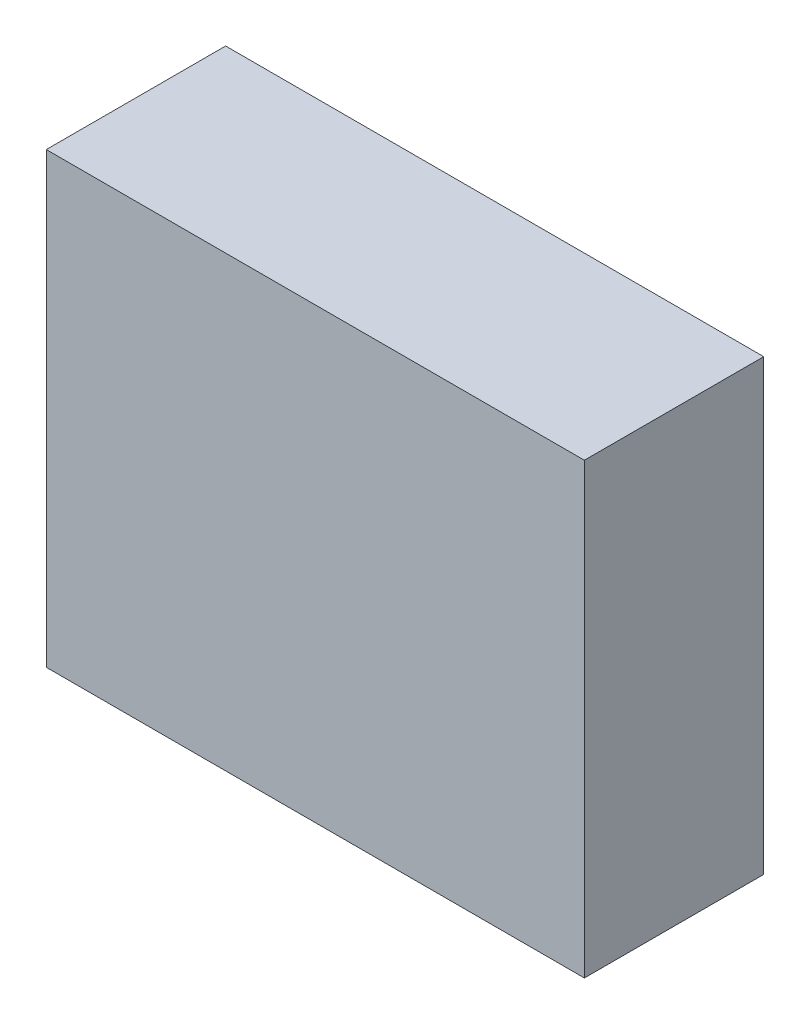
ISO-10303-21;
HEADER;
FILE_DESCRIPTION(('STEP AP214'),'2;1');
FILE_NAME('part.step','',(''),(''),'','','');
FILE_SCHEMA(('AUTOMOTIVE_DESIGN { 1 0 10303 214 1 1 1 1 }'));
ENDSEC;
DATA;
#1=APPLICATION_CONTEXT('core data for automotive mechanical design processes');
#2=APPLICATION_PROTOCOL_DEFINITION('international standard','automotive_design',2000,#1);
#3=PRODUCT_CONTEXT('',#1,'mechanical');
#4=PRODUCT('Part','Part','',(#3));
#5=PRODUCT_RELATED_PRODUCT_CATEGORY('part','',(#4));
#6=PRODUCT_DEFINITION_FORMATION('','',#4);
#7=PRODUCT_DEFINITION_CONTEXT('part definition',#1,'design');
#8=PRODUCT_DEFINITION('design','',#6,#7);
#9=PRODUCT_DEFINITION_SHAPE('','',#8);
#10=(LENGTH_UNIT() NAMED_UNIT(*) SI_UNIT(.MILLI.,.METRE.));
#11=(NAMED_UNIT(*) PLANE_ANGLE_UNIT() SI_UNIT($,.RADIAN.));
#12=(NAMED_UNIT(*) SI_UNIT($,.STERADIAN.) SOLID_ANGLE_UNIT());
#13=UNCERTAINTY_MEASURE_WITH_UNIT(LENGTH_MEASURE(1.E-05),#10,'distance_accuracy_value','');
#14=(GEOMETRIC_REPRESENTATION_CONTEXT(3) GLOBAL_UNCERTAINTY_ASSIGNED_CONTEXT((#13)) GLOBAL_UNIT_ASSIGNED_CONTEXT((#10,
#11,#12)) REPRESENTATION_CONTEXT('',''));
#15=CARTESIAN_POINT('',(0.,0.,0.));
#16=DIRECTION('',(0.,0.,1.));
#17=DIRECTION('',(1.,0.,0.));
#18=AXIS2_PLACEMENT_3D('',#15,#16,#17);
#19=CARTESIAN_POINT('',(15.,-12.5,10.));
#20=DIRECTION('',(-1.,0.,0.));
#21=DIRECTION('',(0.,0.,1.));
#22=AXIS2_PLACEMENT_3D('',#19,#20,#21);
#23=PLANE('',#22);
#24=DIRECTION('',(0.,1.,0.));
#25=VECTOR('',#24,1.);
#26=CARTESIAN_POINT('',(15.,-12.5,0.));
#27=LINE('',#26,#25);
#28=CARTESIAN_POINT('',(15.,-12.5,0.));
#29=VERTEX_POINT('',#28);
#30=CARTESIAN_POINT('',(15.,12.5,0.));
#31=VERTEX_POINT('',#30);
#32=EDGE_CURVE('E96',#29,#31,#27,.T.);
#33=ORIENTED_EDGE('',*,*,#32,.T.);
#34=DIRECTION('',(0.,0.,-1.));
#35=VECTOR('',#34,1.);
#36=CARTESIAN_POINT('',(15.,12.5,10.));
#37=LINE('',#36,#35);
#38=CARTESIAN_POINT('',(15.,12.5,10.));
#39=VERTEX_POINT('',#38);
#40=EDGE_CURVE('E11',#39,#31,#37,.T.);
#41=ORIENTED_EDGE('',*,*,#40,.F.);
#42=DIRECTION('',(0.,1.,0.));
#43=VECTOR('',#42,1.);
#44=CARTESIAN_POINT('',(15.,-12.5,10.));
#45=LINE('',#44,#43);
#46=CARTESIAN_POINT('',(15.,-12.5,10.));
#47=VERTEX_POINT('',#46);
#48=EDGE_CURVE('E84',#47,#39,#45,.T.);
#49=ORIENTED_EDGE('',*,*,#48,.F.);
#50=DIRECTION('',(0.,0.,-1.));
#51=VECTOR('',#50,1.);
#52=CARTESIAN_POINT('',(15.,-12.5,10.));
#53=LINE('',#52,#51);
#54=EDGE_CURVE('E92',#47,#29,#53,.T.);
#55=ORIENTED_EDGE('',*,*,#54,.T.);
#56=EDGE_LOOP('',(#33,#41,#49,#55));
#57=FACE_BOUND('',#56,.T.);
#58=ADVANCED_FACE('F33',(#57),#23,.F.);
#59=CARTESIAN_POINT('',(-15.,12.5,10.));
#60=DIRECTION('',(0.,-1.,0.));
#61=DIRECTION('',(0.,0.,-1.));
#62=AXIS2_PLACEMENT_3D('',#59,#60,#61);
#63=PLANE('',#62);
#64=DIRECTION('',(-1.,0.,0.));
#65=VECTOR('',#64,1.);
#66=CARTESIAN_POINT('',(-15.,12.5,0.));
#67=LINE('',#66,#65);
#68=CARTESIAN_POINT('',(-15.,12.5,0.));
#69=VERTEX_POINT('',#68);
#70=EDGE_CURVE('E88',#31,#69,#67,.T.);
#71=ORIENTED_EDGE('',*,*,#70,.T.);
#72=DIRECTION('',(0.,0.,-1.));
#73=VECTOR('',#72,1.);
#74=CARTESIAN_POINT('',(-15.,12.5,10.));
#75=LINE('',#74,#73);
#76=CARTESIAN_POINT('',(-15.,12.5,10.));
#77=VERTEX_POINT('',#76);
#78=EDGE_CURVE('E41',#77,#69,#75,.T.);
#79=ORIENTED_EDGE('',*,*,#78,.F.);
#80=DIRECTION('',(-1.,0.,0.));
#81=VECTOR('',#80,1.);
#82=CARTESIAN_POINT('',(-15.,12.5,10.));
#83=LINE('',#82,#81);
#84=EDGE_CURVE('E79',#39,#77,#83,.T.);
#85=ORIENTED_EDGE('',*,*,#84,.F.);
#86=ORIENTED_EDGE('',*,*,#40,.T.);
#87=EDGE_LOOP('',(#71,#79,#85,#86));
#88=FACE_BOUND('',#87,.T.);
#89=ADVANCED_FACE('F87',(#88),#63,.F.);
#90=CARTESIAN_POINT('',(-15.,-12.5,10.));
#91=DIRECTION('',(1.,0.,0.));
#92=DIRECTION('',(0.,0.,-1.));
#93=AXIS2_PLACEMENT_3D('',#90,#91,#92);
#94=PLANE('',#93);
#95=DIRECTION('',(0.,-1.,0.));
#96=VECTOR('',#95,1.);
#97=CARTESIAN_POINT('',(-15.,-12.5,0.));
#98=LINE('',#97,#96);
#99=CARTESIAN_POINT('',(-15.,-12.5,0.));
#100=VERTEX_POINT('',#99);
#101=EDGE_CURVE('E66',#69,#100,#98,.T.);
#102=ORIENTED_EDGE('',*,*,#101,.T.);
#103=DIRECTION('',(0.,0.,-1.));
#104=VECTOR('',#103,1.);
#105=CARTESIAN_POINT('',(-15.,-12.5,10.));
#106=LINE('',#105,#104);
#107=CARTESIAN_POINT('',(-15.,-12.5,10.));
#108=VERTEX_POINT('',#107);
#109=EDGE_CURVE('E89',#108,#100,#106,.T.);
#110=ORIENTED_EDGE('',*,*,#109,.F.);
#111=DIRECTION('',(0.,-1.,0.));
#112=VECTOR('',#111,1.);
#113=CARTESIAN_POINT('',(-15.,-12.5,10.));
#114=LINE('',#113,#112);
#115=EDGE_CURVE('E82',#77,#108,#114,.T.);
#116=ORIENTED_EDGE('',*,*,#115,.F.);
#117=ORIENTED_EDGE('',*,*,#78,.T.);
#118=EDGE_LOOP('',(#102,#110,#116,#117));
#119=FACE_BOUND('',#118,.T.);
#120=ADVANCED_FACE('F90',(#119),#94,.F.);
#121=CARTESIAN_POINT('',(-15.,-12.5,10.));
#122=DIRECTION('',(0.,1.,0.));
#123=DIRECTION('',(0.,0.,1.));
#124=AXIS2_PLACEMENT_3D('',#121,#122,#123);
#125=PLANE('',#124);
#126=DIRECTION('',(1.,0.,0.));
#127=VECTOR('',#126,1.);
#128=CARTESIAN_POINT('',(-15.,-12.5,0.));
#129=LINE('',#128,#127);
#130=EDGE_CURVE('E72',#100,#29,#129,.T.);
#131=ORIENTED_EDGE('',*,*,#130,.T.);
#132=ORIENTED_EDGE('',*,*,#54,.F.);
#133=DIRECTION('',(1.,0.,0.));
#134=VECTOR('',#133,1.);
#135=CARTESIAN_POINT('',(-15.,-12.5,10.));
#136=LINE('',#135,#134);
#137=EDGE_CURVE('E49',#108,#47,#136,.T.);
#138=ORIENTED_EDGE('',*,*,#137,.F.);
#139=ORIENTED_EDGE('',*,*,#109,.T.);
#140=EDGE_LOOP('',(#131,#132,#138,#139));
#141=FACE_BOUND('',#140,.T.);
#142=ADVANCED_FACE('F103',(#141),#125,.F.);
#143=CARTESIAN_POINT('',(0.,0.,10.));
#144=DIRECTION('',(0.,0.,-1.));
#145=DIRECTION('',(-1.,0.,0.));
#146=AXIS2_PLACEMENT_3D('',#143,#144,#145);
#147=PLANE('',#146);
#148=ORIENTED_EDGE('',*,*,#48,.T.);
#149=ORIENTED_EDGE('',*,*,#84,.T.);
#150=ORIENTED_EDGE('',*,*,#115,.T.);
#151=ORIENTED_EDGE('',*,*,#137,.T.);
#152=EDGE_LOOP('',(#148,#149,#150,#151));
#153=FACE_BOUND('',#152,.T.);
#154=ADVANCED_FACE('F80',(#153),#147,.F.);
#155=CARTESIAN_POINT('',(0.,0.,0.));
#156=DIRECTION('',(0.,0.,-1.));
#157=DIRECTION('',(-1.,0.,0.));
#158=AXIS2_PLACEMENT_3D('',#155,#156,#157);
#159=PLANE('',#158);
#160=ORIENTED_EDGE('',*,*,#32,.F.);
#161=ORIENTED_EDGE('',*,*,#130,.F.);
#162=ORIENTED_EDGE('',*,*,#101,.F.);
#163=ORIENTED_EDGE('',*,*,#70,.F.);
#164=EDGE_LOOP('',(#160,#161,#162,#163));
#165=FACE_BOUND('',#164,.T.);
#166=ADVANCED_FACE('F106',(#165),#159,.T.);
#167=CLOSED_SHELL('',(#58,#89,#120,#142,#154,#166));
#168=MANIFOLD_SOLID_BREP('B2',#167);
#169=ADVANCED_BREP_SHAPE_REPRESENTATION('',(#18,#168),#14);
#170=SHAPE_DEFINITION_REPRESENTATION(#9,#169);
ENDSEC;
END-ISO-10303-21;
